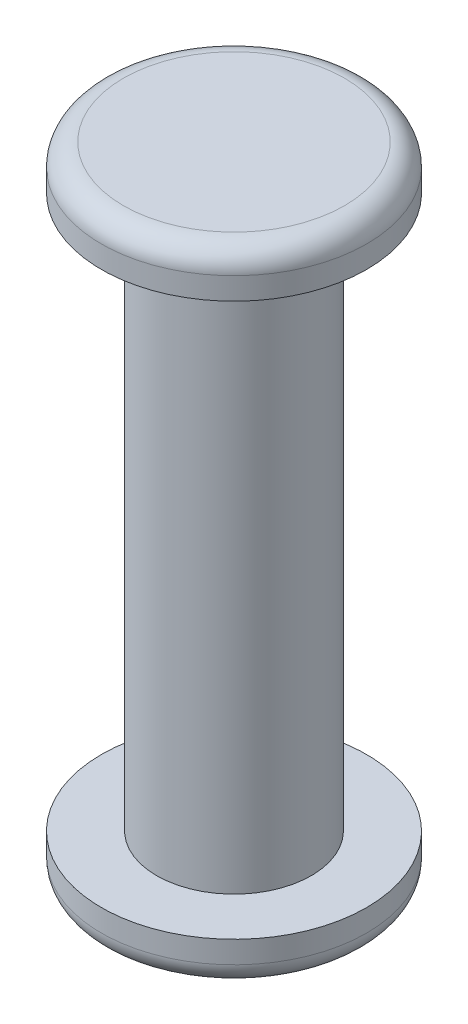
ISO-10303-21;
HEADER;
FILE_DESCRIPTION(('STEP AP214'),'2;1');
FILE_NAME('part.step','',(''),(''),'','','');
FILE_SCHEMA(('AUTOMOTIVE_DESIGN { 1 0 10303 214 1 1 1 1 }'));
ENDSEC;
DATA;
#1=APPLICATION_CONTEXT('core data for automotive mechanical design processes');
#2=APPLICATION_PROTOCOL_DEFINITION('international standard','automotive_design',2000,#1);
#3=PRODUCT_CONTEXT('',#1,'mechanical');
#4=PRODUCT('Part','Part','',(#3));
#5=PRODUCT_RELATED_PRODUCT_CATEGORY('part','',(#4));
#6=PRODUCT_DEFINITION_FORMATION('','',#4);
#7=PRODUCT_DEFINITION_CONTEXT('part definition',#1,'design');
#8=PRODUCT_DEFINITION('design','',#6,#7);
#9=PRODUCT_DEFINITION_SHAPE('','',#8);
#10=(LENGTH_UNIT() NAMED_UNIT(*) SI_UNIT(.MILLI.,.METRE.));
#11=(NAMED_UNIT(*) PLANE_ANGLE_UNIT() SI_UNIT($,.RADIAN.));
#12=(NAMED_UNIT(*) SI_UNIT($,.STERADIAN.) SOLID_ANGLE_UNIT());
#13=UNCERTAINTY_MEASURE_WITH_UNIT(LENGTH_MEASURE(1.E-05),#10,'distance_accuracy_value','');
#14=(GEOMETRIC_REPRESENTATION_CONTEXT(3) GLOBAL_UNCERTAINTY_ASSIGNED_CONTEXT((#13)) GLOBAL_UNIT_ASSIGNED_CONTEXT((#10,
#11,#12)) REPRESENTATION_CONTEXT('',''));
#15=CARTESIAN_POINT('',(0.,0.,0.));
#16=DIRECTION('',(0.,0.,1.));
#17=DIRECTION('',(1.,0.,0.));
#18=AXIS2_PLACEMENT_3D('',#15,#16,#17);
#19=CARTESIAN_POINT('',(0.,12.5,0.));
#20=DIRECTION('',(0.,-1.,0.));
#21=DIRECTION('',(0.,0.,-1.));
#22=AXIS2_PLACEMENT_3D('',#19,#20,#21);
#23=CYLINDRICAL_SURFACE('',#22,1.75);
#24=CARTESIAN_POINT('',(0.,12.5,0.));
#25=DIRECTION('',(0.,1.,0.));
#26=DIRECTION('',(0.,0.,1.));
#27=AXIS2_PLACEMENT_3D('',#24,#25,#26);
#28=CIRCLE('',#27,1.75);
#29=CARTESIAN_POINT('',(0.,12.5,1.75));
#30=VERTEX_POINT('',#29);
#31=EDGE_CURVE('E63',#30,#30,#28,.T.);
#32=ORIENTED_EDGE('',*,*,#31,.F.);
#33=EDGE_LOOP('',(#32));
#34=FACE_BOUND('',#33,.T.);
#35=CARTESIAN_POINT('',(0.,0.,0.));
#36=DIRECTION('',(0.,1.,0.));
#37=DIRECTION('',(0.,0.,1.));
#38=AXIS2_PLACEMENT_3D('',#35,#36,#37);
#39=CIRCLE('',#38,1.75);
#40=CARTESIAN_POINT('',(0.,0.,1.75));
#41=VERTEX_POINT('',#40);
#42=EDGE_CURVE('E64',#41,#41,#39,.T.);
#43=ORIENTED_EDGE('',*,*,#42,.T.);
#44=EDGE_LOOP('',(#43));
#45=FACE_BOUND('',#44,.T.);
#46=ADVANCED_FACE('F38',(#34,#45),#23,.T.);
#47=CARTESIAN_POINT('',(0.,0.,0.));
#48=DIRECTION('',(0.,-1.,0.));
#49=DIRECTION('',(1.,0.,0.));
#50=AXIS2_PLACEMENT_3D('',#47,#48,#49);
#51=PLANE('',#50);
#52=ORIENTED_EDGE('',*,*,#42,.F.);
#53=EDGE_LOOP('',(#52));
#54=FACE_BOUND('',#53,.T.);
#55=CARTESIAN_POINT('',(0.,0.,0.));
#56=DIRECTION('',(0.,-1.,0.));
#57=DIRECTION('',(1.,0.,0.));
#58=AXIS2_PLACEMENT_3D('',#55,#56,#57);
#59=CIRCLE('',#58,3.);
#60=CARTESIAN_POINT('',(3.,0.,0.));
#61=VERTEX_POINT('',#60);
#62=EDGE_CURVE('E67',#61,#61,#59,.T.);
#63=ORIENTED_EDGE('',*,*,#62,.F.);
#64=EDGE_LOOP('',(#63));
#65=FACE_BOUND('',#64,.T.);
#66=ADVANCED_FACE('F95',(#54,#65),#51,.F.);
#67=CARTESIAN_POINT('',(0.,0.,0.));
#68=DIRECTION('',(0.,-1.,0.));
#69=DIRECTION('',(1.,0.,0.));
#70=AXIS2_PLACEMENT_3D('',#67,#68,#69);
#71=CYLINDRICAL_SURFACE('',#70,3.);
#72=CARTESIAN_POINT('',(0.,-0.500000000000001,0.));
#73=DIRECTION('',(0.,1.,0.));
#74=DIRECTION('',(-1.,0.,0.));
#75=AXIS2_PLACEMENT_3D('',#72,#73,#74);
#76=CIRCLE('',#75,3.);
#77=CARTESIAN_POINT('',(-3.,-0.500000000000001,0.));
#78=VERTEX_POINT('',#77);
#79=EDGE_CURVE('E52',#78,#78,#76,.T.);
#80=ORIENTED_EDGE('',*,*,#79,.T.);
#81=EDGE_LOOP('',(#80));
#82=FACE_BOUND('',#81,.T.);
#83=ORIENTED_EDGE('',*,*,#62,.T.);
#84=EDGE_LOOP('',(#83));
#85=FACE_BOUND('',#84,.T.);
#86=ADVANCED_FACE('F101',(#82,#85),#71,.T.);
#87=CARTESIAN_POINT('',(-3.,-1.,0.));
#88=DIRECTION('',(0.,1.,0.));
#89=DIRECTION('',(-1.,0.,0.));
#90=AXIS2_PLACEMENT_3D('',#87,#88,#89);
#91=PLANE('',#90);
#92=CARTESIAN_POINT('',(0.,-1.,0.));
#93=DIRECTION('',(0.,1.,0.));
#94=DIRECTION('',(-1.,0.,0.));
#95=AXIS2_PLACEMENT_3D('',#92,#93,#94);
#96=CIRCLE('',#95,2.5);
#97=CARTESIAN_POINT('',(-2.5,-1.,0.));
#98=VERTEX_POINT('',#97);
#99=EDGE_CURVE('E57',#98,#98,#96,.F.);
#100=ORIENTED_EDGE('',*,*,#99,.T.);
#101=EDGE_LOOP('',(#100));
#102=FACE_BOUND('',#101,.T.);
#103=ADVANCED_FACE('F91',(#102),#91,.F.);
#104=CARTESIAN_POINT('',(0.,12.5,0.));
#105=DIRECTION('',(0.,1.,0.));
#106=DIRECTION('',(-1.,0.,0.));
#107=AXIS2_PLACEMENT_3D('',#104,#105,#106);
#108=PLANE('',#107);
#109=ORIENTED_EDGE('',*,*,#31,.T.);
#110=EDGE_LOOP('',(#109));
#111=FACE_BOUND('',#110,.T.);
#112=CARTESIAN_POINT('',(0.,12.5,0.));
#113=DIRECTION('',(0.,-1.,0.));
#114=DIRECTION('',(1.,0.,0.));
#115=AXIS2_PLACEMENT_3D('',#112,#113,#114);
#116=CIRCLE('',#115,3.);
#117=CARTESIAN_POINT('',(3.,12.5,0.));
#118=VERTEX_POINT('',#117);
#119=EDGE_CURVE('E74',#118,#118,#116,.T.);
#120=ORIENTED_EDGE('',*,*,#119,.T.);
#121=EDGE_LOOP('',(#120));
#122=FACE_BOUND('',#121,.T.);
#123=ADVANCED_FACE('F79',(#111,#122),#108,.F.);
#124=CARTESIAN_POINT('',(0.,0.,0.));
#125=DIRECTION('',(0.,-1.,0.));
#126=DIRECTION('',(1.,0.,0.));
#127=AXIS2_PLACEMENT_3D('',#124,#125,#126);
#128=CYLINDRICAL_SURFACE('',#127,3.);
#129=CARTESIAN_POINT('',(0.,13.,0.));
#130=DIRECTION('',(0.,-1.,0.));
#131=DIRECTION('',(1.,0.,0.));
#132=AXIS2_PLACEMENT_3D('',#129,#130,#131);
#133=CIRCLE('',#132,3.);
#134=CARTESIAN_POINT('',(3.,13.,0.));
#135=VERTEX_POINT('',#134);
#136=EDGE_CURVE('E46',#135,#135,#133,.T.);
#137=ORIENTED_EDGE('',*,*,#136,.T.);
#138=EDGE_LOOP('',(#137));
#139=FACE_BOUND('',#138,.T.);
#140=ORIENTED_EDGE('',*,*,#119,.F.);
#141=EDGE_LOOP('',(#140));
#142=FACE_BOUND('',#141,.T.);
#143=ADVANCED_FACE('F81',(#139,#142),#128,.T.);
#144=CARTESIAN_POINT('',(-3.,13.5,0.));
#145=DIRECTION('',(0.,-1.,0.));
#146=DIRECTION('',(1.,0.,0.));
#147=AXIS2_PLACEMENT_3D('',#144,#145,#146);
#148=PLANE('',#147);
#149=CARTESIAN_POINT('',(0.,13.5,0.));
#150=DIRECTION('',(0.,-1.,0.));
#151=DIRECTION('',(1.,0.,0.));
#152=AXIS2_PLACEMENT_3D('',#149,#150,#151);
#153=CIRCLE('',#152,2.5);
#154=CARTESIAN_POINT('',(2.5,13.5,0.));
#155=VERTEX_POINT('',#154);
#156=EDGE_CURVE('E10',#155,#155,#153,.F.);
#157=ORIENTED_EDGE('',*,*,#156,.T.);
#158=EDGE_LOOP('',(#157));
#159=FACE_BOUND('',#158,.T.);
#160=ADVANCED_FACE('F83',(#159),#148,.F.);
#161=CARTESIAN_POINT('',(0.,-0.500000000000001,0.));
#162=DIRECTION('',(0.,1.,0.));
#163=DIRECTION('',(-1.,0.,0.));
#164=AXIS2_PLACEMENT_3D('',#161,#162,#163);
#165=TOROIDAL_SURFACE('',#164,2.5,0.5);
#166=ORIENTED_EDGE('',*,*,#79,.F.);
#167=EDGE_LOOP('',(#166));
#168=FACE_BOUND('',#167,.T.);
#169=ORIENTED_EDGE('',*,*,#99,.F.);
#170=EDGE_LOOP('',(#169));
#171=FACE_BOUND('',#170,.T.);
#172=ADVANCED_FACE('F89',(#168,#171),#165,.T.);
#173=CARTESIAN_POINT('',(0.,13.,0.));
#174=DIRECTION('',(0.,-1.,0.));
#175=DIRECTION('',(1.,0.,0.));
#176=AXIS2_PLACEMENT_3D('',#173,#174,#175);
#177=TOROIDAL_SURFACE('',#176,2.5,0.5);
#178=ORIENTED_EDGE('',*,*,#156,.F.);
#179=EDGE_LOOP('',(#178));
#180=FACE_BOUND('',#179,.T.);
#181=ORIENTED_EDGE('',*,*,#136,.F.);
#182=EDGE_LOOP('',(#181));
#183=FACE_BOUND('',#182,.T.);
#184=ADVANCED_FACE('F40',(#180,#183),#177,.T.);
#185=CLOSED_SHELL('',(#46,#66,#86,#103,#123,#143,#160,#172,#184));
#186=MANIFOLD_SOLID_BREP('B2',#185);
#187=ADVANCED_BREP_SHAPE_REPRESENTATION('',(#18,#186),#14);
#188=SHAPE_DEFINITION_REPRESENTATION(#9,#187);
ENDSEC;
END-ISO-10303-21;
